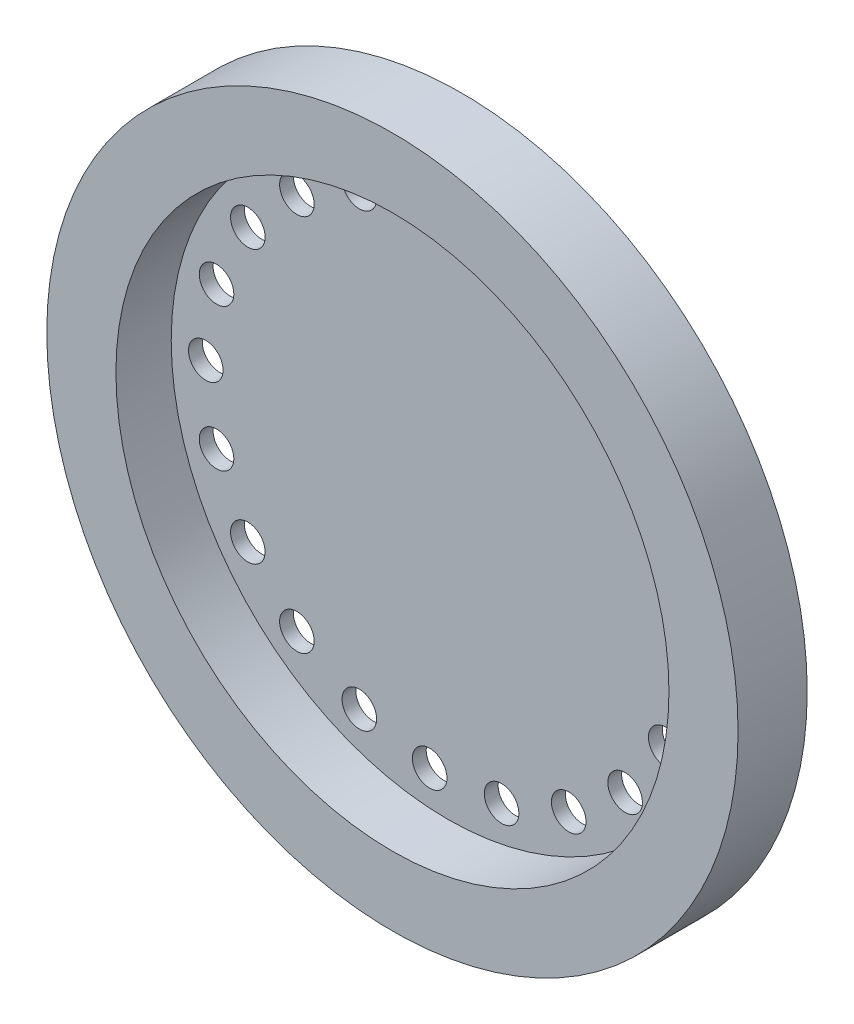
ISO-10303-21;
HEADER;
FILE_DESCRIPTION(('STEP AP214'),'2;1');
FILE_NAME('part.step','',(''),(''),'','','');
FILE_SCHEMA(('AUTOMOTIVE_DESIGN { 1 0 10303 214 1 1 1 1 }'));
ENDSEC;
DATA;
#1=APPLICATION_CONTEXT('core data for automotive mechanical design processes');
#2=APPLICATION_PROTOCOL_DEFINITION('international standard','automotive_design',2000,#1);
#3=PRODUCT_CONTEXT('',#1,'mechanical');
#4=PRODUCT('Part','Part','',(#3));
#5=PRODUCT_RELATED_PRODUCT_CATEGORY('part','',(#4));
#6=PRODUCT_DEFINITION_FORMATION('','',#4);
#7=PRODUCT_DEFINITION_CONTEXT('part definition',#1,'design');
#8=PRODUCT_DEFINITION('design','',#6,#7);
#9=PRODUCT_DEFINITION_SHAPE('','',#8);
#10=(LENGTH_UNIT() NAMED_UNIT(*) SI_UNIT(.MILLI.,.METRE.));
#11=(NAMED_UNIT(*) PLANE_ANGLE_UNIT() SI_UNIT($,.RADIAN.));
#12=(NAMED_UNIT(*) SI_UNIT($,.STERADIAN.) SOLID_ANGLE_UNIT());
#13=UNCERTAINTY_MEASURE_WITH_UNIT(LENGTH_MEASURE(1.E-05),#10,'distance_accuracy_value','');
#14=(GEOMETRIC_REPRESENTATION_CONTEXT(3) GLOBAL_UNCERTAINTY_ASSIGNED_CONTEXT((#13)) GLOBAL_UNIT_ASSIGNED_CONTEXT((#10,
#11,#12)) REPRESENTATION_CONTEXT('',''));
#15=CARTESIAN_POINT('',(0.,0.,0.));
#16=DIRECTION('',(0.,0.,1.));
#17=DIRECTION('',(1.,0.,0.));
#18=AXIS2_PLACEMENT_3D('',#15,#16,#17);
#19=CARTESIAN_POINT('',(0.,0.,12.7));
#20=DIRECTION('',(0.,0.,1.));
#21=DIRECTION('',(1.,0.,0.));
#22=AXIS2_PLACEMENT_3D('',#19,#20,#21);
#23=PLANE('',#22);
#24=CARTESIAN_POINT('',(0.,0.,12.7));
#25=DIRECTION('',(0.,0.,1.));
#26=DIRECTION('',(1.,0.,0.));
#27=AXIS2_PLACEMENT_3D('',#24,#25,#26);
#28=CIRCLE('',#27,63.5);
#29=CARTESIAN_POINT('',(63.5,0.,12.7));
#30=VERTEX_POINT('',#29);
#31=EDGE_CURVE('E51',#30,#30,#28,.T.);
#32=ORIENTED_EDGE('',*,*,#31,.T.);
#33=EDGE_LOOP('',(#32));
#34=FACE_BOUND('',#33,.T.);
#35=CARTESIAN_POINT('',(0.,0.,12.7));
#36=DIRECTION('',(0.,0.,1.));
#37=DIRECTION('',(1.,0.,0.));
#38=AXIS2_PLACEMENT_3D('',#35,#36,#37);
#39=CIRCLE('',#38,50.8);
#40=CARTESIAN_POINT('',(50.8,0.,12.7));
#41=VERTEX_POINT('',#40);
#42=EDGE_CURVE('E62',#41,#41,#39,.T.);
#43=ORIENTED_EDGE('',*,*,#42,.F.);
#44=EDGE_LOOP('',(#43));
#45=FACE_BOUND('',#44,.T.);
#46=ADVANCED_FACE('F43',(#34,#45),#23,.T.);
#47=CARTESIAN_POINT('',(0.,0.,0.));
#48=DIRECTION('',(0.,0.,1.));
#49=DIRECTION('',(1.,0.,0.));
#50=AXIS2_PLACEMENT_3D('',#47,#48,#49);
#51=PLANE('',#50);
#52=CARTESIAN_POINT('',(0.,0.,0.));
#53=DIRECTION('',(0.,0.,1.));
#54=DIRECTION('',(1.,0.,0.));
#55=AXIS2_PLACEMENT_3D('',#52,#53,#54);
#56=CIRCLE('',#55,63.5);
#57=CARTESIAN_POINT('',(63.5,0.,0.));
#58=VERTEX_POINT('',#57);
#59=EDGE_CURVE('E56',#58,#58,#56,.T.);
#60=ORIENTED_EDGE('',*,*,#59,.F.);
#61=EDGE_LOOP('',(#60));
#62=FACE_BOUND('',#61,.T.);
#63=CARTESIAN_POINT('',(-44.45,0.,0.));
#64=DIRECTION('',(0.,0.,1.));
#65=DIRECTION('',(1.,0.,0.));
#66=AXIS2_PLACEMENT_3D('',#63,#64,#65);
#67=CIRCLE('',#66,3.175);
#68=CARTESIAN_POINT('',(-41.275,0.,0.));
#69=VERTEX_POINT('',#68);
#70=EDGE_CURVE('E68',#69,#69,#67,.T.);
#71=ORIENTED_EDGE('',*,*,#70,.T.);
#72=EDGE_LOOP('',(#71));
#73=FACE_BOUND('',#72,.T.);
#74=CARTESIAN_POINT('',(-42.4752112171939,13.1018675025647,0.));
#75=DIRECTION('',(0.,0.,1.));
#76=DIRECTION('',(1.,0.,0.));
#77=AXIS2_PLACEMENT_3D('',#74,#75,#76);
#78=CIRCLE('',#77,3.175);
#79=CARTESIAN_POINT('',(-39.3002112171939,13.1018675025647,0.));
#80=VERTEX_POINT('',#79);
#81=EDGE_CURVE('E76',#80,#80,#78,.T.);
#82=ORIENTED_EDGE('',*,*,#81,.T.);
#83=EDGE_LOOP('',(#82));
#84=FACE_BOUND('',#83,.T.);
#85=CARTESIAN_POINT('',(-36.7263135183459,25.0395765809281,0.));
#86=DIRECTION('',(0.,0.,1.));
#87=DIRECTION('',(1.,0.,0.));
#88=AXIS2_PLACEMENT_3D('',#85,#86,#87);
#89=CIRCLE('',#88,3.175);
#90=CARTESIAN_POINT('',(-33.5513135183459,25.0395765809281,0.));
#91=VERTEX_POINT('',#90);
#92=EDGE_CURVE('E84',#91,#91,#89,.T.);
#93=ORIENTED_EDGE('',*,*,#92,.T.);
#94=EDGE_LOOP('',(#93));
#95=FACE_BOUND('',#94,.T.);
#96=CARTESIAN_POINT('',(-27.7141216926206,34.752409395704,0.));
#97=DIRECTION('',(0.,0.,1.));
#98=DIRECTION('',(1.,0.,0.));
#99=AXIS2_PLACEMENT_3D('',#96,#97,#98);
#100=CIRCLE('',#99,3.175);
#101=CARTESIAN_POINT('',(-24.5391216926206,34.752409395704,0.));
#102=VERTEX_POINT('',#101);
#103=EDGE_CURVE('E92',#102,#102,#100,.T.);
#104=ORIENTED_EDGE('',*,*,#103,.T.);
#105=EDGE_LOOP('',(#104));
#106=FACE_BOUND('',#105,.T.);
#107=CARTESIAN_POINT('',(-16.2394085330861,41.3773381272349,0.));
#108=DIRECTION('',(0.,0.,1.));
#109=DIRECTION('',(1.,0.,0.));
#110=AXIS2_PLACEMENT_3D('',#107,#108,#109);
#111=CIRCLE('',#110,3.17499999999999);
#112=CARTESIAN_POINT('',(-13.0644085330862,41.3773381272349,0.));
#113=VERTEX_POINT('',#112);
#114=EDGE_CURVE('E100',#113,#113,#111,.T.);
#115=ORIENTED_EDGE('',*,*,#114,.T.);
#116=EDGE_LOOP('',(#115));
#117=FACE_BOUND('',#116,.T.);
#118=CARTESIAN_POINT('',(-3.32175265991641,44.3257087847035,0.));
#119=DIRECTION('',(0.,0.,1.));
#120=DIRECTION('',(1.,0.,0.));
#121=AXIS2_PLACEMENT_3D('',#118,#119,#120);
#122=CIRCLE('',#121,3.175);
#123=CARTESIAN_POINT('',(-0.146752659916403,44.3257087847035,0.));
#124=VERTEX_POINT('',#123);
#125=EDGE_CURVE('E108',#124,#124,#122,.T.);
#126=ORIENTED_EDGE('',*,*,#125,.T.);
#127=EDGE_LOOP('',(#126));
#128=FACE_BOUND('',#127,.T.);
#129=CARTESIAN_POINT('',(9.89105551435834,43.335545696482,0.));
#130=DIRECTION('',(0.,0.,1.));
#131=DIRECTION('',(1.,0.,0.));
#132=AXIS2_PLACEMENT_3D('',#129,#130,#131);
#133=CIRCLE('',#132,3.17499999999999);
#134=CARTESIAN_POINT('',(13.0660555143583,43.335545696482,0.));
#135=VERTEX_POINT('',#134);
#136=EDGE_CURVE('E116',#135,#135,#133,.T.);
#137=ORIENTED_EDGE('',*,*,#136,.T.);
#138=EDGE_LOOP('',(#137));
#139=FACE_BOUND('',#138,.T.);
#140=CARTESIAN_POINT('',(22.2250000000002,38.4948291982182,0.));
#141=DIRECTION('',(0.,0.,1.));
#142=DIRECTION('',(1.,0.,0.));
#143=AXIS2_PLACEMENT_3D('',#140,#141,#142);
#144=CIRCLE('',#143,3.175);
#145=CARTESIAN_POINT('',(25.4000000000002,38.4948291982182,0.));
#146=VERTEX_POINT('',#145);
#147=EDGE_CURVE('E124',#146,#146,#144,.T.);
#148=ORIENTED_EDGE('',*,*,#147,.T.);
#149=EDGE_LOOP('',(#148));
#150=FACE_BOUND('',#149,.T.);
#151=CARTESIAN_POINT('',(32.5841557028359,30.2336781939172,0.));
#152=DIRECTION('',(0.,0.,1.));
#153=DIRECTION('',(1.,0.,0.));
#154=AXIS2_PLACEMENT_3D('',#151,#152,#153);
#155=CIRCLE('',#154,3.175);
#156=CARTESIAN_POINT('',(35.7591557028359,30.2336781939172,0.));
#157=VERTEX_POINT('',#156);
#158=EDGE_CURVE('E132',#157,#157,#155,.T.);
#159=ORIENTED_EDGE('',*,*,#158,.T.);
#160=EDGE_LOOP('',(#159));
#161=FACE_BOUND('',#160,.T.);
#162=CARTESIAN_POINT('',(40.0480661782627,19.2861322037752,0.));
#163=DIRECTION('',(0.,0.,1.));
#164=DIRECTION('',(1.,0.,0.));
#165=AXIS2_PLACEMENT_3D('',#162,#163,#164);
#166=CIRCLE('',#165,3.175);
#167=CARTESIAN_POINT('',(43.2230661782627,19.2861322037752,0.));
#168=VERTEX_POINT('',#167);
#169=EDGE_CURVE('E140',#168,#168,#166,.T.);
#170=ORIENTED_EDGE('',*,*,#169,.T.);
#171=EDGE_LOOP('',(#170));
#172=FACE_BOUND('',#171,.T.);
#173=CARTESIAN_POINT('',(43.953530225707,6.62492873153065,0.));
#174=DIRECTION('',(0.,0.,1.));
#175=DIRECTION('',(1.,0.,0.));
#176=AXIS2_PLACEMENT_3D('',#173,#174,#175);
#177=CIRCLE('',#176,3.175);
#178=CARTESIAN_POINT('',(47.128530225707,6.62492873153065,0.));
#179=VERTEX_POINT('',#178);
#180=EDGE_CURVE('E148',#179,#179,#177,.T.);
#181=ORIENTED_EDGE('',*,*,#180,.T.);
#182=EDGE_LOOP('',(#181));
#183=FACE_BOUND('',#182,.T.);
#184=CARTESIAN_POINT('',(43.9535302257069,-6.62492873153129,0.));
#185=DIRECTION('',(0.,0.,1.));
#186=DIRECTION('',(1.,0.,0.));
#187=AXIS2_PLACEMENT_3D('',#184,#185,#186);
#188=CIRCLE('',#187,3.175);
#189=CARTESIAN_POINT('',(47.1285302257069,-6.62492873153129,0.));
#190=VERTEX_POINT('',#189);
#191=EDGE_CURVE('E156',#190,#190,#188,.T.);
#192=ORIENTED_EDGE('',*,*,#191,.T.);
#193=EDGE_LOOP('',(#192));
#194=FACE_BOUND('',#193,.T.);
#195=CARTESIAN_POINT('',(40.0480661782624,-19.2861322037758,0.));
#196=DIRECTION('',(0.,0.,1.));
#197=DIRECTION('',(1.,0.,0.));
#198=AXIS2_PLACEMENT_3D('',#195,#196,#197);
#199=CIRCLE('',#198,3.175);
#200=CARTESIAN_POINT('',(43.2230661782624,-19.2861322037758,0.));
#201=VERTEX_POINT('',#200);
#202=EDGE_CURVE('E164',#201,#201,#199,.T.);
#203=ORIENTED_EDGE('',*,*,#202,.T.);
#204=EDGE_LOOP('',(#203));
#205=FACE_BOUND('',#204,.T.);
#206=CARTESIAN_POINT('',(32.5841557028355,-30.2336781939177,0.));
#207=DIRECTION('',(0.,0.,1.));
#208=DIRECTION('',(1.,0.,0.));
#209=AXIS2_PLACEMENT_3D('',#206,#207,#208);
#210=CIRCLE('',#209,3.175);
#211=CARTESIAN_POINT('',(35.7591557028355,-30.2336781939177,0.));
#212=VERTEX_POINT('',#211);
#213=EDGE_CURVE('E172',#212,#212,#210,.T.);
#214=ORIENTED_EDGE('',*,*,#213,.T.);
#215=EDGE_LOOP('',(#214));
#216=FACE_BOUND('',#215,.T.);
#217=CARTESIAN_POINT('',(22.2249999999996,-38.4948291982185,0.));
#218=DIRECTION('',(0.,0.,1.));
#219=DIRECTION('',(1.,0.,0.));
#220=AXIS2_PLACEMENT_3D('',#217,#218,#219);
#221=CIRCLE('',#220,3.175);
#222=CARTESIAN_POINT('',(25.3999999999996,-38.4948291982185,0.));
#223=VERTEX_POINT('',#222);
#224=EDGE_CURVE('E180',#223,#223,#221,.T.);
#225=ORIENTED_EDGE('',*,*,#224,.T.);
#226=EDGE_LOOP('',(#225));
#227=FACE_BOUND('',#226,.T.);
#228=CARTESIAN_POINT('',(9.89105551435772,-43.3355456964822,0.));
#229=DIRECTION('',(0.,0.,1.));
#230=DIRECTION('',(1.,0.,0.));
#231=AXIS2_PLACEMENT_3D('',#228,#229,#230);
#232=CIRCLE('',#231,3.175);
#233=CARTESIAN_POINT('',(13.0660555143577,-43.3355456964822,0.));
#234=VERTEX_POINT('',#233);
#235=EDGE_CURVE('E188',#234,#234,#232,.T.);
#236=ORIENTED_EDGE('',*,*,#235,.T.);
#237=EDGE_LOOP('',(#236));
#238=FACE_BOUND('',#237,.T.);
#239=CARTESIAN_POINT('',(-3.32175265991704,-44.3257087847034,0.));
#240=DIRECTION('',(0.,0.,1.));
#241=DIRECTION('',(1.,0.,0.));
#242=AXIS2_PLACEMENT_3D('',#239,#240,#241);
#243=CIRCLE('',#242,3.175);
#244=CARTESIAN_POINT('',(-0.146752659917039,-44.3257087847034,0.));
#245=VERTEX_POINT('',#244);
#246=EDGE_CURVE('E196',#245,#245,#243,.T.);
#247=ORIENTED_EDGE('',*,*,#246,.T.);
#248=EDGE_LOOP('',(#247));
#249=FACE_BOUND('',#248,.T.);
#250=CARTESIAN_POINT('',(-16.2394085330867,-41.3773381272347,0.));
#251=DIRECTION('',(0.,0.,1.));
#252=DIRECTION('',(1.,0.,0.));
#253=AXIS2_PLACEMENT_3D('',#250,#251,#252);
#254=CIRCLE('',#253,3.175);
#255=CARTESIAN_POINT('',(-13.0644085330867,-41.3773381272347,0.));
#256=VERTEX_POINT('',#255);
#257=EDGE_CURVE('E204',#256,#256,#254,.T.);
#258=ORIENTED_EDGE('',*,*,#257,.T.);
#259=EDGE_LOOP('',(#258));
#260=FACE_BOUND('',#259,.T.);
#261=CARTESIAN_POINT('',(-27.7141216926211,-34.7524093957036,0.));
#262=DIRECTION('',(0.,0.,1.));
#263=DIRECTION('',(1.,0.,0.));
#264=AXIS2_PLACEMENT_3D('',#261,#262,#263);
#265=CIRCLE('',#264,3.175);
#266=CARTESIAN_POINT('',(-24.5391216926211,-34.7524093957036,0.));
#267=VERTEX_POINT('',#266);
#268=EDGE_CURVE('E212',#267,#267,#265,.T.);
#269=ORIENTED_EDGE('',*,*,#268,.T.);
#270=EDGE_LOOP('',(#269));
#271=FACE_BOUND('',#270,.T.);
#272=CARTESIAN_POINT('',(-36.7263135183463,-25.0395765809275,0.));
#273=DIRECTION('',(0.,0.,1.));
#274=DIRECTION('',(1.,0.,0.));
#275=AXIS2_PLACEMENT_3D('',#272,#273,#274);
#276=CIRCLE('',#275,3.175);
#277=CARTESIAN_POINT('',(-33.5513135183463,-25.0395765809275,0.));
#278=VERTEX_POINT('',#277);
#279=EDGE_CURVE('E220',#278,#278,#276,.T.);
#280=ORIENTED_EDGE('',*,*,#279,.T.);
#281=EDGE_LOOP('',(#280));
#282=FACE_BOUND('',#281,.T.);
#283=CARTESIAN_POINT('',(-42.4752112171941,-13.1018675025641,0.));
#284=DIRECTION('',(0.,0.,1.));
#285=DIRECTION('',(1.,0.,0.));
#286=AXIS2_PLACEMENT_3D('',#283,#284,#285);
#287=CIRCLE('',#286,3.175);
#288=CARTESIAN_POINT('',(-39.3002112171941,-13.1018675025641,0.));
#289=VERTEX_POINT('',#288);
#290=EDGE_CURVE('E228',#289,#289,#287,.T.);
#291=ORIENTED_EDGE('',*,*,#290,.T.);
#292=EDGE_LOOP('',(#291));
#293=FACE_BOUND('',#292,.T.);
#294=ADVANCED_FACE('F257',(#62,#73,#84,#95,#106,#117,#128,#139,#150,#161,#172,#183,#194,#205,
#216,#227,#238,#249,#260,#271,#282,#293),#51,.F.);
#295=CARTESIAN_POINT('',(0.,0.,12.7));
#296=DIRECTION('',(0.,0.,-1.));
#297=DIRECTION('',(-1.,0.,0.));
#298=AXIS2_PLACEMENT_3D('',#295,#296,#297);
#299=CYLINDRICAL_SURFACE('',#298,63.5);
#300=ORIENTED_EDGE('',*,*,#31,.F.);
#301=EDGE_LOOP('',(#300));
#302=FACE_BOUND('',#301,.T.);
#303=ORIENTED_EDGE('',*,*,#59,.T.);
#304=EDGE_LOOP('',(#303));
#305=FACE_BOUND('',#304,.T.);
#306=ADVANCED_FACE('F45',(#302,#305),#299,.T.);
#307=CARTESIAN_POINT('',(0.,0.,12.7));
#308=DIRECTION('',(0.,0.,-1.));
#309=DIRECTION('',(-1.,0.,0.));
#310=AXIS2_PLACEMENT_3D('',#307,#308,#309);
#311=CYLINDRICAL_SURFACE('',#310,50.8);
#312=CARTESIAN_POINT('',(0.,0.,2.54));
#313=DIRECTION('',(0.,0.,1.));
#314=DIRECTION('',(1.,0.,0.));
#315=AXIS2_PLACEMENT_3D('',#312,#313,#314);
#316=CIRCLE('',#315,50.8);
#317=CARTESIAN_POINT('',(50.8,0.,2.54));
#318=VERTEX_POINT('',#317);
#319=EDGE_CURVE('E10',#318,#318,#316,.T.);
#320=ORIENTED_EDGE('',*,*,#319,.F.);
#321=EDGE_LOOP('',(#320));
#322=FACE_BOUND('',#321,.T.);
#323=ORIENTED_EDGE('',*,*,#42,.T.);
#324=EDGE_LOOP('',(#323));
#325=FACE_BOUND('',#324,.T.);
#326=ADVANCED_FACE('F242',(#322,#325),#311,.F.);
#327=CARTESIAN_POINT('',(0.,0.,2.54));
#328=DIRECTION('',(0.,0.,1.));
#329=DIRECTION('',(1.,0.,0.));
#330=AXIS2_PLACEMENT_3D('',#327,#328,#329);
#331=PLANE('',#330);
#332=CARTESIAN_POINT('',(-36.7263135183463,-25.0395765809275,2.54));
#333=DIRECTION('',(0.,0.,1.));
#334=DIRECTION('',(1.,0.,0.));
#335=AXIS2_PLACEMENT_3D('',#332,#333,#334);
#336=CIRCLE('',#335,3.175);
#337=CARTESIAN_POINT('',(-33.5513135183463,-25.0395765809275,2.54));
#338=VERTEX_POINT('',#337);
#339=EDGE_CURVE('E216',#338,#338,#336,.T.);
#340=ORIENTED_EDGE('',*,*,#339,.F.);
#341=EDGE_LOOP('',(#340));
#342=FACE_BOUND('',#341,.T.);
#343=CARTESIAN_POINT('',(-16.2394085330867,-41.3773381272347,2.54));
#344=DIRECTION('',(0.,0.,1.));
#345=DIRECTION('',(1.,0.,0.));
#346=AXIS2_PLACEMENT_3D('',#343,#344,#345);
#347=CIRCLE('',#346,3.175);
#348=CARTESIAN_POINT('',(-13.0644085330867,-41.3773381272347,2.54));
#349=VERTEX_POINT('',#348);
#350=EDGE_CURVE('E200',#349,#349,#347,.T.);
#351=ORIENTED_EDGE('',*,*,#350,.F.);
#352=EDGE_LOOP('',(#351));
#353=FACE_BOUND('',#352,.T.);
#354=CARTESIAN_POINT('',(9.89105551435772,-43.3355456964822,2.54));
#355=DIRECTION('',(0.,0.,1.));
#356=DIRECTION('',(1.,0.,0.));
#357=AXIS2_PLACEMENT_3D('',#354,#355,#356);
#358=CIRCLE('',#357,3.175);
#359=CARTESIAN_POINT('',(13.0660555143577,-43.3355456964822,2.54));
#360=VERTEX_POINT('',#359);
#361=EDGE_CURVE('E184',#360,#360,#358,.T.);
#362=ORIENTED_EDGE('',*,*,#361,.F.);
#363=EDGE_LOOP('',(#362));
#364=FACE_BOUND('',#363,.T.);
#365=CARTESIAN_POINT('',(32.5841557028355,-30.2336781939177,2.54));
#366=DIRECTION('',(0.,0.,1.));
#367=DIRECTION('',(1.,0.,0.));
#368=AXIS2_PLACEMENT_3D('',#365,#366,#367);
#369=CIRCLE('',#368,3.175);
#370=CARTESIAN_POINT('',(35.7591557028355,-30.2336781939177,2.54));
#371=VERTEX_POINT('',#370);
#372=EDGE_CURVE('E168',#371,#371,#369,.T.);
#373=ORIENTED_EDGE('',*,*,#372,.F.);
#374=EDGE_LOOP('',(#373));
#375=FACE_BOUND('',#374,.T.);
#376=CARTESIAN_POINT('',(43.9535302257069,-6.62492873153129,2.54));
#377=DIRECTION('',(0.,0.,1.));
#378=DIRECTION('',(1.,0.,0.));
#379=AXIS2_PLACEMENT_3D('',#376,#377,#378);
#380=CIRCLE('',#379,3.175);
#381=CARTESIAN_POINT('',(47.1285302257069,-6.62492873153129,2.54));
#382=VERTEX_POINT('',#381);
#383=EDGE_CURVE('E152',#382,#382,#380,.T.);
#384=ORIENTED_EDGE('',*,*,#383,.F.);
#385=EDGE_LOOP('',(#384));
#386=FACE_BOUND('',#385,.T.);
#387=CARTESIAN_POINT('',(40.0480661782627,19.2861322037752,2.54));
#388=DIRECTION('',(0.,0.,1.));
#389=DIRECTION('',(1.,0.,0.));
#390=AXIS2_PLACEMENT_3D('',#387,#388,#389);
#391=CIRCLE('',#390,3.175);
#392=CARTESIAN_POINT('',(43.2230661782627,19.2861322037752,2.54));
#393=VERTEX_POINT('',#392);
#394=EDGE_CURVE('E136',#393,#393,#391,.T.);
#395=ORIENTED_EDGE('',*,*,#394,.F.);
#396=EDGE_LOOP('',(#395));
#397=FACE_BOUND('',#396,.T.);
#398=CARTESIAN_POINT('',(22.2250000000002,38.4948291982182,2.54));
#399=DIRECTION('',(0.,0.,1.));
#400=DIRECTION('',(1.,0.,0.));
#401=AXIS2_PLACEMENT_3D('',#398,#399,#400);
#402=CIRCLE('',#401,3.175);
#403=CARTESIAN_POINT('',(25.4000000000002,38.4948291982182,2.54));
#404=VERTEX_POINT('',#403);
#405=EDGE_CURVE('E120',#404,#404,#402,.T.);
#406=ORIENTED_EDGE('',*,*,#405,.F.);
#407=EDGE_LOOP('',(#406));
#408=FACE_BOUND('',#407,.T.);
#409=CARTESIAN_POINT('',(-3.32175265991641,44.3257087847035,2.54));
#410=DIRECTION('',(0.,0.,1.));
#411=DIRECTION('',(1.,0.,0.));
#412=AXIS2_PLACEMENT_3D('',#409,#410,#411);
#413=CIRCLE('',#412,3.175);
#414=CARTESIAN_POINT('',(-0.146752659916403,44.3257087847035,2.54));
#415=VERTEX_POINT('',#414);
#416=EDGE_CURVE('E104',#415,#415,#413,.T.);
#417=ORIENTED_EDGE('',*,*,#416,.F.);
#418=EDGE_LOOP('',(#417));
#419=FACE_BOUND('',#418,.T.);
#420=CARTESIAN_POINT('',(-27.7141216926206,34.752409395704,2.54));
#421=DIRECTION('',(0.,0.,1.));
#422=DIRECTION('',(1.,0.,0.));
#423=AXIS2_PLACEMENT_3D('',#420,#421,#422);
#424=CIRCLE('',#423,3.175);
#425=CARTESIAN_POINT('',(-24.5391216926206,34.752409395704,2.54));
#426=VERTEX_POINT('',#425);
#427=EDGE_CURVE('E88',#426,#426,#424,.T.);
#428=ORIENTED_EDGE('',*,*,#427,.F.);
#429=EDGE_LOOP('',(#428));
#430=FACE_BOUND('',#429,.T.);
#431=CARTESIAN_POINT('',(-42.4752112171939,13.1018675025647,2.54));
#432=DIRECTION('',(0.,0.,1.));
#433=DIRECTION('',(1.,0.,0.));
#434=AXIS2_PLACEMENT_3D('',#431,#432,#433);
#435=CIRCLE('',#434,3.175);
#436=CARTESIAN_POINT('',(-39.3002112171939,13.1018675025647,2.54));
#437=VERTEX_POINT('',#436);
#438=EDGE_CURVE('E72',#437,#437,#435,.T.);
#439=ORIENTED_EDGE('',*,*,#438,.F.);
#440=EDGE_LOOP('',(#439));
#441=FACE_BOUND('',#440,.T.);
#442=ORIENTED_EDGE('',*,*,#319,.T.);
#443=EDGE_LOOP('',(#442));
#444=FACE_BOUND('',#443,.T.);
#445=CARTESIAN_POINT('',(-44.45,0.,2.54));
#446=DIRECTION('',(0.,0.,1.));
#447=DIRECTION('',(1.,0.,0.));
#448=AXIS2_PLACEMENT_3D('',#445,#446,#447);
#449=CIRCLE('',#448,3.175);
#450=CARTESIAN_POINT('',(-41.275,0.,2.54));
#451=VERTEX_POINT('',#450);
#452=EDGE_CURVE('E67',#451,#451,#449,.T.);
#453=ORIENTED_EDGE('',*,*,#452,.F.);
#454=EDGE_LOOP('',(#453));
#455=FACE_BOUND('',#454,.T.);
#456=CARTESIAN_POINT('',(-36.7263135183459,25.0395765809281,2.54));
#457=DIRECTION('',(0.,0.,1.));
#458=DIRECTION('',(1.,0.,0.));
#459=AXIS2_PLACEMENT_3D('',#456,#457,#458);
#460=CIRCLE('',#459,3.175);
#461=CARTESIAN_POINT('',(-33.5513135183459,25.0395765809281,2.54));
#462=VERTEX_POINT('',#461);
#463=EDGE_CURVE('E80',#462,#462,#460,.T.);
#464=ORIENTED_EDGE('',*,*,#463,.F.);
#465=EDGE_LOOP('',(#464));
#466=FACE_BOUND('',#465,.T.);
#467=CARTESIAN_POINT('',(-16.2394085330861,41.3773381272349,2.54));
#468=DIRECTION('',(0.,0.,1.));
#469=DIRECTION('',(1.,0.,0.));
#470=AXIS2_PLACEMENT_3D('',#467,#468,#469);
#471=CIRCLE('',#470,3.17499999999999);
#472=CARTESIAN_POINT('',(-13.0644085330862,41.3773381272349,2.54));
#473=VERTEX_POINT('',#472);
#474=EDGE_CURVE('E96',#473,#473,#471,.T.);
#475=ORIENTED_EDGE('',*,*,#474,.F.);
#476=EDGE_LOOP('',(#475));
#477=FACE_BOUND('',#476,.T.);
#478=CARTESIAN_POINT('',(9.89105551435834,43.335545696482,2.54));
#479=DIRECTION('',(0.,0.,1.));
#480=DIRECTION('',(1.,0.,0.));
#481=AXIS2_PLACEMENT_3D('',#478,#479,#480);
#482=CIRCLE('',#481,3.17499999999999);
#483=CARTESIAN_POINT('',(13.0660555143583,43.335545696482,2.54));
#484=VERTEX_POINT('',#483);
#485=EDGE_CURVE('E112',#484,#484,#482,.T.);
#486=ORIENTED_EDGE('',*,*,#485,.F.);
#487=EDGE_LOOP('',(#486));
#488=FACE_BOUND('',#487,.T.);
#489=CARTESIAN_POINT('',(32.5841557028359,30.2336781939172,2.54));
#490=DIRECTION('',(0.,0.,1.));
#491=DIRECTION('',(1.,0.,0.));
#492=AXIS2_PLACEMENT_3D('',#489,#490,#491);
#493=CIRCLE('',#492,3.175);
#494=CARTESIAN_POINT('',(35.7591557028359,30.2336781939172,2.54));
#495=VERTEX_POINT('',#494);
#496=EDGE_CURVE('E128',#495,#495,#493,.T.);
#497=ORIENTED_EDGE('',*,*,#496,.F.);
#498=EDGE_LOOP('',(#497));
#499=FACE_BOUND('',#498,.T.);
#500=CARTESIAN_POINT('',(43.953530225707,6.62492873153065,2.54));
#501=DIRECTION('',(0.,0.,1.));
#502=DIRECTION('',(1.,0.,0.));
#503=AXIS2_PLACEMENT_3D('',#500,#501,#502);
#504=CIRCLE('',#503,3.175);
#505=CARTESIAN_POINT('',(47.128530225707,6.62492873153065,2.54));
#506=VERTEX_POINT('',#505);
#507=EDGE_CURVE('E144',#506,#506,#504,.T.);
#508=ORIENTED_EDGE('',*,*,#507,.F.);
#509=EDGE_LOOP('',(#508));
#510=FACE_BOUND('',#509,.T.);
#511=CARTESIAN_POINT('',(40.0480661782624,-19.2861322037758,2.54));
#512=DIRECTION('',(0.,0.,1.));
#513=DIRECTION('',(1.,0.,0.));
#514=AXIS2_PLACEMENT_3D('',#511,#512,#513);
#515=CIRCLE('',#514,3.175);
#516=CARTESIAN_POINT('',(43.2230661782624,-19.2861322037758,2.54));
#517=VERTEX_POINT('',#516);
#518=EDGE_CURVE('E160',#517,#517,#515,.T.);
#519=ORIENTED_EDGE('',*,*,#518,.F.);
#520=EDGE_LOOP('',(#519));
#521=FACE_BOUND('',#520,.T.);
#522=CARTESIAN_POINT('',(22.2249999999996,-38.4948291982185,2.54));
#523=DIRECTION('',(0.,0.,1.));
#524=DIRECTION('',(1.,0.,0.));
#525=AXIS2_PLACEMENT_3D('',#522,#523,#524);
#526=CIRCLE('',#525,3.175);
#527=CARTESIAN_POINT('',(25.3999999999996,-38.4948291982185,2.54));
#528=VERTEX_POINT('',#527);
#529=EDGE_CURVE('E176',#528,#528,#526,.T.);
#530=ORIENTED_EDGE('',*,*,#529,.F.);
#531=EDGE_LOOP('',(#530));
#532=FACE_BOUND('',#531,.T.);
#533=CARTESIAN_POINT('',(-3.32175265991704,-44.3257087847034,2.54));
#534=DIRECTION('',(0.,0.,1.));
#535=DIRECTION('',(1.,0.,0.));
#536=AXIS2_PLACEMENT_3D('',#533,#534,#535);
#537=CIRCLE('',#536,3.175);
#538=CARTESIAN_POINT('',(-0.146752659917039,-44.3257087847034,2.54));
#539=VERTEX_POINT('',#538);
#540=EDGE_CURVE('E192',#539,#539,#537,.T.);
#541=ORIENTED_EDGE('',*,*,#540,.F.);
#542=EDGE_LOOP('',(#541));
#543=FACE_BOUND('',#542,.T.);
#544=CARTESIAN_POINT('',(-27.7141216926211,-34.7524093957036,2.54));
#545=DIRECTION('',(0.,0.,1.));
#546=DIRECTION('',(1.,0.,0.));
#547=AXIS2_PLACEMENT_3D('',#544,#545,#546);
#548=CIRCLE('',#547,3.175);
#549=CARTESIAN_POINT('',(-24.5391216926211,-34.7524093957036,2.54));
#550=VERTEX_POINT('',#549);
#551=EDGE_CURVE('E208',#550,#550,#548,.T.);
#552=ORIENTED_EDGE('',*,*,#551,.F.);
#553=EDGE_LOOP('',(#552));
#554=FACE_BOUND('',#553,.T.);
#555=CARTESIAN_POINT('',(-42.4752112171941,-13.1018675025641,2.54));
#556=DIRECTION('',(0.,0.,1.));
#557=DIRECTION('',(1.,0.,0.));
#558=AXIS2_PLACEMENT_3D('',#555,#556,#557);
#559=CIRCLE('',#558,3.175);
#560=CARTESIAN_POINT('',(-39.3002112171941,-13.1018675025641,2.54));
#561=VERTEX_POINT('',#560);
#562=EDGE_CURVE('E224',#561,#561,#559,.T.);
#563=ORIENTED_EDGE('',*,*,#562,.F.);
#564=EDGE_LOOP('',(#563));
#565=FACE_BOUND('',#564,.T.);
#566=ADVANCED_FACE('F239',(#342,#353,#364,#375,#386,#397,#408,#419,#430,#441,#444,#455,#466,
#477,#488,#499,#510,#521,#532,#543,#554,#565),#331,.T.);
#567=CARTESIAN_POINT('',(-44.45,0.,2.54));
#568=DIRECTION('',(0.,0.,-1.));
#569=DIRECTION('',(-1.,0.,0.));
#570=AXIS2_PLACEMENT_3D('',#567,#568,#569);
#571=CYLINDRICAL_SURFACE('',#570,3.175);
#572=ORIENTED_EDGE('',*,*,#452,.T.);
#573=EDGE_LOOP('',(#572));
#574=FACE_BOUND('',#573,.T.);
#575=ORIENTED_EDGE('',*,*,#70,.F.);
#576=EDGE_LOOP('',(#575));
#577=FACE_BOUND('',#576,.T.);
#578=ADVANCED_FACE('F241',(#574,#577),#571,.F.);
#579=CARTESIAN_POINT('',(-42.4752112171939,13.1018675025647,2.54));
#580=DIRECTION('',(0.,0.,-1.));
#581=DIRECTION('',(-1.,0.,0.));
#582=AXIS2_PLACEMENT_3D('',#579,#580,#581);
#583=CYLINDRICAL_SURFACE('',#582,3.175);
#584=ORIENTED_EDGE('',*,*,#438,.T.);
#585=EDGE_LOOP('',(#584));
#586=FACE_BOUND('',#585,.T.);
#587=ORIENTED_EDGE('',*,*,#81,.F.);
#588=EDGE_LOOP('',(#587));
#589=FACE_BOUND('',#588,.T.);
#590=ADVANCED_FACE('F249',(#586,#589),#583,.F.);
#591=CARTESIAN_POINT('',(-36.7263135183459,25.0395765809281,2.54));
#592=DIRECTION('',(0.,0.,-1.));
#593=DIRECTION('',(-1.,0.,0.));
#594=AXIS2_PLACEMENT_3D('',#591,#592,#593);
#595=CYLINDRICAL_SURFACE('',#594,3.175);
#596=ORIENTED_EDGE('',*,*,#463,.T.);
#597=EDGE_LOOP('',(#596));
#598=FACE_BOUND('',#597,.T.);
#599=ORIENTED_EDGE('',*,*,#92,.F.);
#600=EDGE_LOOP('',(#599));
#601=FACE_BOUND('',#600,.T.);
#602=ADVANCED_FACE('F385',(#598,#601),#595,.F.);
#603=CARTESIAN_POINT('',(-27.7141216926206,34.752409395704,2.54));
#604=DIRECTION('',(0.,0.,-1.));
#605=DIRECTION('',(-1.,0.,0.));
#606=AXIS2_PLACEMENT_3D('',#603,#604,#605);
#607=CYLINDRICAL_SURFACE('',#606,3.175);
#608=ORIENTED_EDGE('',*,*,#427,.T.);
#609=EDGE_LOOP('',(#608));
#610=FACE_BOUND('',#609,.T.);
#611=ORIENTED_EDGE('',*,*,#103,.F.);
#612=EDGE_LOOP('',(#611));
#613=FACE_BOUND('',#612,.T.);
#614=ADVANCED_FACE('F381',(#610,#613),#607,.F.);
#615=CARTESIAN_POINT('',(-16.2394085330861,41.3773381272349,2.54));
#616=DIRECTION('',(0.,0.,-1.));
#617=DIRECTION('',(-1.,0.,0.));
#618=AXIS2_PLACEMENT_3D('',#615,#616,#617);
#619=CYLINDRICAL_SURFACE('',#618,3.17499999999999);
#620=ORIENTED_EDGE('',*,*,#474,.T.);
#621=EDGE_LOOP('',(#620));
#622=FACE_BOUND('',#621,.T.);
#623=ORIENTED_EDGE('',*,*,#114,.F.);
#624=EDGE_LOOP('',(#623));
#625=FACE_BOUND('',#624,.T.);
#626=ADVANCED_FACE('F377',(#622,#625),#619,.F.);
#627=CARTESIAN_POINT('',(-3.32175265991641,44.3257087847035,2.54));
#628=DIRECTION('',(0.,0.,-1.));
#629=DIRECTION('',(-1.,0.,0.));
#630=AXIS2_PLACEMENT_3D('',#627,#628,#629);
#631=CYLINDRICAL_SURFACE('',#630,3.175);
#632=ORIENTED_EDGE('',*,*,#416,.T.);
#633=EDGE_LOOP('',(#632));
#634=FACE_BOUND('',#633,.T.);
#635=ORIENTED_EDGE('',*,*,#125,.F.);
#636=EDGE_LOOP('',(#635));
#637=FACE_BOUND('',#636,.T.);
#638=ADVANCED_FACE('F373',(#634,#637),#631,.F.);
#639=CARTESIAN_POINT('',(9.89105551435834,43.335545696482,2.54));
#640=DIRECTION('',(0.,0.,-1.));
#641=DIRECTION('',(-1.,0.,0.));
#642=AXIS2_PLACEMENT_3D('',#639,#640,#641);
#643=CYLINDRICAL_SURFACE('',#642,3.17499999999999);
#644=ORIENTED_EDGE('',*,*,#485,.T.);
#645=EDGE_LOOP('',(#644));
#646=FACE_BOUND('',#645,.T.);
#647=ORIENTED_EDGE('',*,*,#136,.F.);
#648=EDGE_LOOP('',(#647));
#649=FACE_BOUND('',#648,.T.);
#650=ADVANCED_FACE('F369',(#646,#649),#643,.F.);
#651=CARTESIAN_POINT('',(22.2250000000002,38.4948291982182,2.54));
#652=DIRECTION('',(0.,0.,-1.));
#653=DIRECTION('',(-1.,0.,0.));
#654=AXIS2_PLACEMENT_3D('',#651,#652,#653);
#655=CYLINDRICAL_SURFACE('',#654,3.175);
#656=ORIENTED_EDGE('',*,*,#405,.T.);
#657=EDGE_LOOP('',(#656));
#658=FACE_BOUND('',#657,.T.);
#659=ORIENTED_EDGE('',*,*,#147,.F.);
#660=EDGE_LOOP('',(#659));
#661=FACE_BOUND('',#660,.T.);
#662=ADVANCED_FACE('F365',(#658,#661),#655,.F.);
#663=CARTESIAN_POINT('',(32.5841557028359,30.2336781939172,2.54));
#664=DIRECTION('',(0.,0.,-1.));
#665=DIRECTION('',(-1.,0.,0.));
#666=AXIS2_PLACEMENT_3D('',#663,#664,#665);
#667=CYLINDRICAL_SURFACE('',#666,3.175);
#668=ORIENTED_EDGE('',*,*,#496,.T.);
#669=EDGE_LOOP('',(#668));
#670=FACE_BOUND('',#669,.T.);
#671=ORIENTED_EDGE('',*,*,#158,.F.);
#672=EDGE_LOOP('',(#671));
#673=FACE_BOUND('',#672,.T.);
#674=ADVANCED_FACE('F361',(#670,#673),#667,.F.);
#675=CARTESIAN_POINT('',(40.0480661782627,19.2861322037752,2.54));
#676=DIRECTION('',(0.,0.,-1.));
#677=DIRECTION('',(-1.,0.,0.));
#678=AXIS2_PLACEMENT_3D('',#675,#676,#677);
#679=CYLINDRICAL_SURFACE('',#678,3.175);
#680=ORIENTED_EDGE('',*,*,#394,.T.);
#681=EDGE_LOOP('',(#680));
#682=FACE_BOUND('',#681,.T.);
#683=ORIENTED_EDGE('',*,*,#169,.F.);
#684=EDGE_LOOP('',(#683));
#685=FACE_BOUND('',#684,.T.);
#686=ADVANCED_FACE('F357',(#682,#685),#679,.F.);
#687=CARTESIAN_POINT('',(43.953530225707,6.62492873153065,2.54));
#688=DIRECTION('',(0.,0.,-1.));
#689=DIRECTION('',(-1.,0.,0.));
#690=AXIS2_PLACEMENT_3D('',#687,#688,#689);
#691=CYLINDRICAL_SURFACE('',#690,3.175);
#692=ORIENTED_EDGE('',*,*,#507,.T.);
#693=EDGE_LOOP('',(#692));
#694=FACE_BOUND('',#693,.T.);
#695=ORIENTED_EDGE('',*,*,#180,.F.);
#696=EDGE_LOOP('',(#695));
#697=FACE_BOUND('',#696,.T.);
#698=ADVANCED_FACE('F353',(#694,#697),#691,.F.);
#699=CARTESIAN_POINT('',(43.9535302257069,-6.62492873153129,2.54));
#700=DIRECTION('',(0.,0.,-1.));
#701=DIRECTION('',(-1.,0.,0.));
#702=AXIS2_PLACEMENT_3D('',#699,#700,#701);
#703=CYLINDRICAL_SURFACE('',#702,3.175);
#704=ORIENTED_EDGE('',*,*,#383,.T.);
#705=EDGE_LOOP('',(#704));
#706=FACE_BOUND('',#705,.T.);
#707=ORIENTED_EDGE('',*,*,#191,.F.);
#708=EDGE_LOOP('',(#707));
#709=FACE_BOUND('',#708,.T.);
#710=ADVANCED_FACE('F349',(#706,#709),#703,.F.);
#711=CARTESIAN_POINT('',(40.0480661782624,-19.2861322037758,2.54));
#712=DIRECTION('',(0.,0.,-1.));
#713=DIRECTION('',(-1.,0.,0.));
#714=AXIS2_PLACEMENT_3D('',#711,#712,#713);
#715=CYLINDRICAL_SURFACE('',#714,3.175);
#716=ORIENTED_EDGE('',*,*,#518,.T.);
#717=EDGE_LOOP('',(#716));
#718=FACE_BOUND('',#717,.T.);
#719=ORIENTED_EDGE('',*,*,#202,.F.);
#720=EDGE_LOOP('',(#719));
#721=FACE_BOUND('',#720,.T.);
#722=ADVANCED_FACE('F345',(#718,#721),#715,.F.);
#723=CARTESIAN_POINT('',(32.5841557028355,-30.2336781939177,2.54));
#724=DIRECTION('',(0.,0.,-1.));
#725=DIRECTION('',(-1.,0.,0.));
#726=AXIS2_PLACEMENT_3D('',#723,#724,#725);
#727=CYLINDRICAL_SURFACE('',#726,3.175);
#728=ORIENTED_EDGE('',*,*,#372,.T.);
#729=EDGE_LOOP('',(#728));
#730=FACE_BOUND('',#729,.T.);
#731=ORIENTED_EDGE('',*,*,#213,.F.);
#732=EDGE_LOOP('',(#731));
#733=FACE_BOUND('',#732,.T.);
#734=ADVANCED_FACE('F341',(#730,#733),#727,.F.);
#735=CARTESIAN_POINT('',(22.2249999999996,-38.4948291982185,2.54));
#736=DIRECTION('',(0.,0.,-1.));
#737=DIRECTION('',(-1.,0.,0.));
#738=AXIS2_PLACEMENT_3D('',#735,#736,#737);
#739=CYLINDRICAL_SURFACE('',#738,3.175);
#740=ORIENTED_EDGE('',*,*,#529,.T.);
#741=EDGE_LOOP('',(#740));
#742=FACE_BOUND('',#741,.T.);
#743=ORIENTED_EDGE('',*,*,#224,.F.);
#744=EDGE_LOOP('',(#743));
#745=FACE_BOUND('',#744,.T.);
#746=ADVANCED_FACE('F337',(#742,#745),#739,.F.);
#747=CARTESIAN_POINT('',(9.89105551435772,-43.3355456964822,2.54));
#748=DIRECTION('',(0.,0.,-1.));
#749=DIRECTION('',(-1.,0.,0.));
#750=AXIS2_PLACEMENT_3D('',#747,#748,#749);
#751=CYLINDRICAL_SURFACE('',#750,3.175);
#752=ORIENTED_EDGE('',*,*,#361,.T.);
#753=EDGE_LOOP('',(#752));
#754=FACE_BOUND('',#753,.T.);
#755=ORIENTED_EDGE('',*,*,#235,.F.);
#756=EDGE_LOOP('',(#755));
#757=FACE_BOUND('',#756,.T.);
#758=ADVANCED_FACE('F333',(#754,#757),#751,.F.);
#759=CARTESIAN_POINT('',(-3.32175265991704,-44.3257087847034,2.54));
#760=DIRECTION('',(0.,0.,-1.));
#761=DIRECTION('',(-1.,0.,0.));
#762=AXIS2_PLACEMENT_3D('',#759,#760,#761);
#763=CYLINDRICAL_SURFACE('',#762,3.175);
#764=ORIENTED_EDGE('',*,*,#540,.T.);
#765=EDGE_LOOP('',(#764));
#766=FACE_BOUND('',#765,.T.);
#767=ORIENTED_EDGE('',*,*,#246,.F.);
#768=EDGE_LOOP('',(#767));
#769=FACE_BOUND('',#768,.T.);
#770=ADVANCED_FACE('F329',(#766,#769),#763,.F.);
#771=CARTESIAN_POINT('',(-16.2394085330867,-41.3773381272347,2.54));
#772=DIRECTION('',(0.,0.,-1.));
#773=DIRECTION('',(-1.,0.,0.));
#774=AXIS2_PLACEMENT_3D('',#771,#772,#773);
#775=CYLINDRICAL_SURFACE('',#774,3.175);
#776=ORIENTED_EDGE('',*,*,#350,.T.);
#777=EDGE_LOOP('',(#776));
#778=FACE_BOUND('',#777,.T.);
#779=ORIENTED_EDGE('',*,*,#257,.F.);
#780=EDGE_LOOP('',(#779));
#781=FACE_BOUND('',#780,.T.);
#782=ADVANCED_FACE('F325',(#778,#781),#775,.F.);
#783=CARTESIAN_POINT('',(-27.7141216926211,-34.7524093957036,2.54));
#784=DIRECTION('',(0.,0.,-1.));
#785=DIRECTION('',(-1.,0.,0.));
#786=AXIS2_PLACEMENT_3D('',#783,#784,#785);
#787=CYLINDRICAL_SURFACE('',#786,3.175);
#788=ORIENTED_EDGE('',*,*,#551,.T.);
#789=EDGE_LOOP('',(#788));
#790=FACE_BOUND('',#789,.T.);
#791=ORIENTED_EDGE('',*,*,#268,.F.);
#792=EDGE_LOOP('',(#791));
#793=FACE_BOUND('',#792,.T.);
#794=ADVANCED_FACE('F319',(#790,#793),#787,.F.);
#795=CARTESIAN_POINT('',(-36.7263135183463,-25.0395765809275,2.54));
#796=DIRECTION('',(0.,0.,-1.));
#797=DIRECTION('',(-1.,0.,0.));
#798=AXIS2_PLACEMENT_3D('',#795,#796,#797);
#799=CYLINDRICAL_SURFACE('',#798,3.175);
#800=ORIENTED_EDGE('',*,*,#339,.T.);
#801=EDGE_LOOP('',(#800));
#802=FACE_BOUND('',#801,.T.);
#803=ORIENTED_EDGE('',*,*,#279,.F.);
#804=EDGE_LOOP('',(#803));
#805=FACE_BOUND('',#804,.T.);
#806=ADVANCED_FACE('F314',(#802,#805),#799,.F.);
#807=CARTESIAN_POINT('',(-42.4752112171941,-13.1018675025641,2.54));
#808=DIRECTION('',(0.,0.,-1.));
#809=DIRECTION('',(-1.,0.,0.));
#810=AXIS2_PLACEMENT_3D('',#807,#808,#809);
#811=CYLINDRICAL_SURFACE('',#810,3.175);
#812=ORIENTED_EDGE('',*,*,#562,.T.);
#813=EDGE_LOOP('',(#812));
#814=FACE_BOUND('',#813,.T.);
#815=ORIENTED_EDGE('',*,*,#290,.F.);
#816=EDGE_LOOP('',(#815));
#817=FACE_BOUND('',#816,.T.);
#818=ADVANCED_FACE('F236',(#814,#817),#811,.F.);
#819=CLOSED_SHELL('',(#46,#294,#306,#326,#566,#578,#590,#602,#614,#626,#638,#650,#662,#674,#686,
#698,#710,#722,#734,#746,#758,#770,#782,#794,#806,#818));
#820=MANIFOLD_SOLID_BREP('B2',#819);
#821=ADVANCED_BREP_SHAPE_REPRESENTATION('',(#18,#820),#14);
#822=SHAPE_DEFINITION_REPRESENTATION(#9,#821);
ENDSEC;
END-ISO-10303-21;
